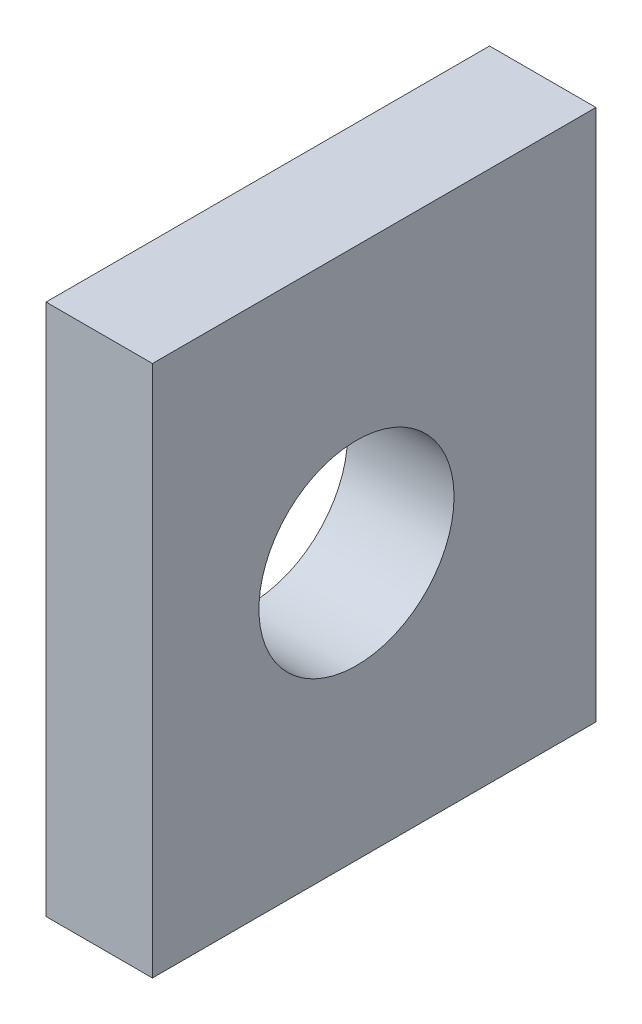
ISO-10303-21;
HEADER;
FILE_DESCRIPTION(('STEP AP214'),'2;1');
FILE_NAME('part.step','',(''),(''),'','','');
FILE_SCHEMA(('AUTOMOTIVE_DESIGN { 1 0 10303 214 1 1 1 1 }'));
ENDSEC;
DATA;
#1=APPLICATION_CONTEXT('core data for automotive mechanical design processes');
#2=APPLICATION_PROTOCOL_DEFINITION('international standard','automotive_design',2000,#1);
#3=PRODUCT_CONTEXT('',#1,'mechanical');
#4=PRODUCT('Part','Part','',(#3));
#5=PRODUCT_RELATED_PRODUCT_CATEGORY('part','',(#4));
#6=PRODUCT_DEFINITION_FORMATION('','',#4);
#7=PRODUCT_DEFINITION_CONTEXT('part definition',#1,'design');
#8=PRODUCT_DEFINITION('design','',#6,#7);
#9=PRODUCT_DEFINITION_SHAPE('','',#8);
#10=(LENGTH_UNIT() NAMED_UNIT(*) SI_UNIT(.MILLI.,.METRE.));
#11=(NAMED_UNIT(*) PLANE_ANGLE_UNIT() SI_UNIT($,.RADIAN.));
#12=(NAMED_UNIT(*) SI_UNIT($,.STERADIAN.) SOLID_ANGLE_UNIT());
#13=UNCERTAINTY_MEASURE_WITH_UNIT(LENGTH_MEASURE(1.E-05),#10,'distance_accuracy_value','');
#14=(GEOMETRIC_REPRESENTATION_CONTEXT(3) GLOBAL_UNCERTAINTY_ASSIGNED_CONTEXT((#13)) GLOBAL_UNIT_ASSIGNED_CONTEXT((#10,
#11,#12)) REPRESENTATION_CONTEXT('',''));
#15=CARTESIAN_POINT('',(0.,0.,0.));
#16=DIRECTION('',(0.,0.,1.));
#17=DIRECTION('',(1.,0.,0.));
#18=AXIS2_PLACEMENT_3D('',#15,#16,#17);
#19=CARTESIAN_POINT('',(525.,270.,130.));
#20=DIRECTION('',(0.,0.,1.));
#21=DIRECTION('',(1.,0.,0.));
#22=AXIS2_PLACEMENT_3D('',#19,#20,#21);
#23=PLANE('',#22);
#24=DIRECTION('',(0.,1.,0.));
#25=VECTOR('',#24,1.);
#26=CARTESIAN_POINT('',(513.,270.,130.));
#27=LINE('',#26,#25);
#28=CARTESIAN_POINT('',(513.,270.,130.));
#29=VERTEX_POINT('',#28);
#30=CARTESIAN_POINT('',(513.,330.,130.));
#31=VERTEX_POINT('',#30);
#32=EDGE_CURVE('E101',#29,#31,#27,.T.);
#33=ORIENTED_EDGE('',*,*,#32,.T.);
#34=DIRECTION('',(-1.,0.,0.));
#35=VECTOR('',#34,1.);
#36=CARTESIAN_POINT('',(525.,330.,130.));
#37=LINE('',#36,#35);
#38=CARTESIAN_POINT('',(525.,330.,130.));
#39=VERTEX_POINT('',#38);
#40=EDGE_CURVE('E11',#39,#31,#37,.T.);
#41=ORIENTED_EDGE('',*,*,#40,.F.);
#42=DIRECTION('',(0.,1.,0.));
#43=VECTOR('',#42,1.);
#44=CARTESIAN_POINT('',(525.,270.,130.));
#45=LINE('',#44,#43);
#46=CARTESIAN_POINT('',(525.,270.,130.));
#47=VERTEX_POINT('',#46);
#48=EDGE_CURVE('E91',#47,#39,#45,.T.);
#49=ORIENTED_EDGE('',*,*,#48,.F.);
#50=DIRECTION('',(-1.,0.,0.));
#51=VECTOR('',#50,1.);
#52=CARTESIAN_POINT('',(525.,270.,130.));
#53=LINE('',#52,#51);
#54=EDGE_CURVE('E99',#47,#29,#53,.T.);
#55=ORIENTED_EDGE('',*,*,#54,.T.);
#56=EDGE_LOOP('',(#33,#41,#49,#55));
#57=FACE_BOUND('',#56,.T.);
#58=ADVANCED_FACE('F39',(#57),#23,.F.);
#59=CARTESIAN_POINT('',(525.,330.,130.));
#60=DIRECTION('',(0.,-1.,0.));
#61=DIRECTION('',(0.,0.,-1.));
#62=AXIS2_PLACEMENT_3D('',#59,#60,#61);
#63=PLANE('',#62);
#64=DIRECTION('',(0.,0.,1.));
#65=VECTOR('',#64,1.);
#66=CARTESIAN_POINT('',(513.,330.,130.));
#67=LINE('',#66,#65);
#68=CARTESIAN_POINT('',(513.,330.,180.));
#69=VERTEX_POINT('',#68);
#70=EDGE_CURVE('E94',#31,#69,#67,.T.);
#71=ORIENTED_EDGE('',*,*,#70,.T.);
#72=DIRECTION('',(-1.,0.,0.));
#73=VECTOR('',#72,1.);
#74=CARTESIAN_POINT('',(525.,330.,180.));
#75=LINE('',#74,#73);
#76=CARTESIAN_POINT('',(525.,330.,180.));
#77=VERTEX_POINT('',#76);
#78=EDGE_CURVE('E48',#77,#69,#75,.T.);
#79=ORIENTED_EDGE('',*,*,#78,.F.);
#80=DIRECTION('',(0.,0.,1.));
#81=VECTOR('',#80,1.);
#82=CARTESIAN_POINT('',(525.,330.,130.));
#83=LINE('',#82,#81);
#84=EDGE_CURVE('E86',#39,#77,#83,.T.);
#85=ORIENTED_EDGE('',*,*,#84,.F.);
#86=ORIENTED_EDGE('',*,*,#40,.T.);
#87=EDGE_LOOP('',(#71,#79,#85,#86));
#88=FACE_BOUND('',#87,.T.);
#89=ADVANCED_FACE('F92',(#88),#63,.F.);
#90=CARTESIAN_POINT('',(525.,270.,180.));
#91=DIRECTION('',(0.,0.,-1.));
#92=DIRECTION('',(-1.,0.,0.));
#93=AXIS2_PLACEMENT_3D('',#90,#91,#92);
#94=PLANE('',#93);
#95=DIRECTION('',(0.,-1.,0.));
#96=VECTOR('',#95,1.);
#97=CARTESIAN_POINT('',(513.,270.,180.));
#98=LINE('',#97,#96);
#99=CARTESIAN_POINT('',(513.,270.,180.));
#100=VERTEX_POINT('',#99);
#101=EDGE_CURVE('E71',#69,#100,#98,.T.);
#102=ORIENTED_EDGE('',*,*,#101,.T.);
#103=DIRECTION('',(-1.,0.,0.));
#104=VECTOR('',#103,1.);
#105=CARTESIAN_POINT('',(525.,270.,180.));
#106=LINE('',#105,#104);
#107=CARTESIAN_POINT('',(525.,270.,180.));
#108=VERTEX_POINT('',#107);
#109=EDGE_CURVE('E96',#108,#100,#106,.T.);
#110=ORIENTED_EDGE('',*,*,#109,.F.);
#111=DIRECTION('',(0.,-1.,0.));
#112=VECTOR('',#111,1.);
#113=CARTESIAN_POINT('',(525.,270.,180.));
#114=LINE('',#113,#112);
#115=EDGE_CURVE('E87',#77,#108,#114,.T.);
#116=ORIENTED_EDGE('',*,*,#115,.F.);
#117=ORIENTED_EDGE('',*,*,#78,.T.);
#118=EDGE_LOOP('',(#102,#110,#116,#117));
#119=FACE_BOUND('',#118,.T.);
#120=ADVANCED_FACE('F97',(#119),#94,.F.);
#121=CARTESIAN_POINT('',(525.,270.,130.));
#122=DIRECTION('',(0.,1.,0.));
#123=DIRECTION('',(0.,0.,1.));
#124=AXIS2_PLACEMENT_3D('',#121,#122,#123);
#125=PLANE('',#124);
#126=DIRECTION('',(0.,0.,-1.));
#127=VECTOR('',#126,1.);
#128=CARTESIAN_POINT('',(513.,270.,130.));
#129=LINE('',#128,#127);
#130=EDGE_CURVE('E80',#100,#29,#129,.T.);
#131=ORIENTED_EDGE('',*,*,#130,.T.);
#132=ORIENTED_EDGE('',*,*,#54,.F.);
#133=DIRECTION('',(0.,0.,-1.));
#134=VECTOR('',#133,1.);
#135=CARTESIAN_POINT('',(525.,270.,130.));
#136=LINE('',#135,#134);
#137=EDGE_CURVE('E57',#108,#47,#136,.T.);
#138=ORIENTED_EDGE('',*,*,#137,.F.);
#139=ORIENTED_EDGE('',*,*,#109,.T.);
#140=EDGE_LOOP('',(#131,#132,#138,#139));
#141=FACE_BOUND('',#140,.T.);
#142=ADVANCED_FACE('F112',(#141),#125,.F.);
#143=CARTESIAN_POINT('',(525.,0.,0.));
#144=DIRECTION('',(1.,0.,0.));
#145=DIRECTION('',(0.,0.,-1.));
#146=AXIS2_PLACEMENT_3D('',#143,#144,#145);
#147=PLANE('',#146);
#148=CARTESIAN_POINT('',(525.,300.,157.));
#149=DIRECTION('',(1.,0.,0.));
#150=DIRECTION('',(0.,0.,-1.));
#151=AXIS2_PLACEMENT_3D('',#148,#149,#150);
#152=CIRCLE('',#151,11.);
#153=CARTESIAN_POINT('',(525.,300.,146.));
#154=VERTEX_POINT('',#153);
#155=EDGE_CURVE('E120',#154,#154,#152,.T.);
#156=ORIENTED_EDGE('',*,*,#155,.F.);
#157=EDGE_LOOP('',(#156));
#158=FACE_BOUND('',#157,.T.);
#159=ORIENTED_EDGE('',*,*,#48,.T.);
#160=ORIENTED_EDGE('',*,*,#84,.T.);
#161=ORIENTED_EDGE('',*,*,#115,.T.);
#162=ORIENTED_EDGE('',*,*,#137,.T.);
#163=EDGE_LOOP('',(#159,#160,#161,#162));
#164=FACE_BOUND('',#163,.T.);
#165=ADVANCED_FACE('F90',(#158,#164),#147,.T.);
#166=CARTESIAN_POINT('',(513.,0.,0.));
#167=DIRECTION('',(1.,0.,0.));
#168=DIRECTION('',(0.,0.,-1.));
#169=AXIS2_PLACEMENT_3D('',#166,#167,#168);
#170=PLANE('',#169);
#171=CARTESIAN_POINT('',(513.,300.,157.));
#172=DIRECTION('',(1.,0.,0.));
#173=DIRECTION('',(0.,0.,-1.));
#174=AXIS2_PLACEMENT_3D('',#171,#172,#173);
#175=CIRCLE('',#174,11.);
#176=CARTESIAN_POINT('',(513.,300.,146.));
#177=VERTEX_POINT('',#176);
#178=EDGE_CURVE('E45',#177,#177,#175,.T.);
#179=ORIENTED_EDGE('',*,*,#178,.T.);
#180=EDGE_LOOP('',(#179));
#181=FACE_BOUND('',#180,.T.);
#182=ORIENTED_EDGE('',*,*,#32,.F.);
#183=ORIENTED_EDGE('',*,*,#130,.F.);
#184=ORIENTED_EDGE('',*,*,#101,.F.);
#185=ORIENTED_EDGE('',*,*,#70,.F.);
#186=EDGE_LOOP('',(#182,#183,#184,#185));
#187=FACE_BOUND('',#186,.T.);
#188=ADVANCED_FACE('F114',(#181,#187),#170,.F.);
#189=CARTESIAN_POINT('',(493.,300.,157.));
#190=DIRECTION('',(1.,0.,0.));
#191=DIRECTION('',(0.,0.,-1.));
#192=AXIS2_PLACEMENT_3D('',#189,#190,#191);
#193=CYLINDRICAL_SURFACE('',#192,11.);
#194=ORIENTED_EDGE('',*,*,#155,.T.);
#195=EDGE_LOOP('',(#194));
#196=FACE_BOUND('',#195,.T.);
#197=ORIENTED_EDGE('',*,*,#178,.F.);
#198=EDGE_LOOP('',(#197));
#199=FACE_BOUND('',#198,.T.);
#200=ADVANCED_FACE('F124',(#196,#199),#193,.F.);
#201=CLOSED_SHELL('',(#58,#89,#120,#142,#165,#188,#200));
#202=MANIFOLD_SOLID_BREP('B2',#201);
#203=ADVANCED_BREP_SHAPE_REPRESENTATION('',(#18,#202),#14);
#204=SHAPE_DEFINITION_REPRESENTATION(#9,#203);
ENDSEC;
END-ISO-10303-21;
